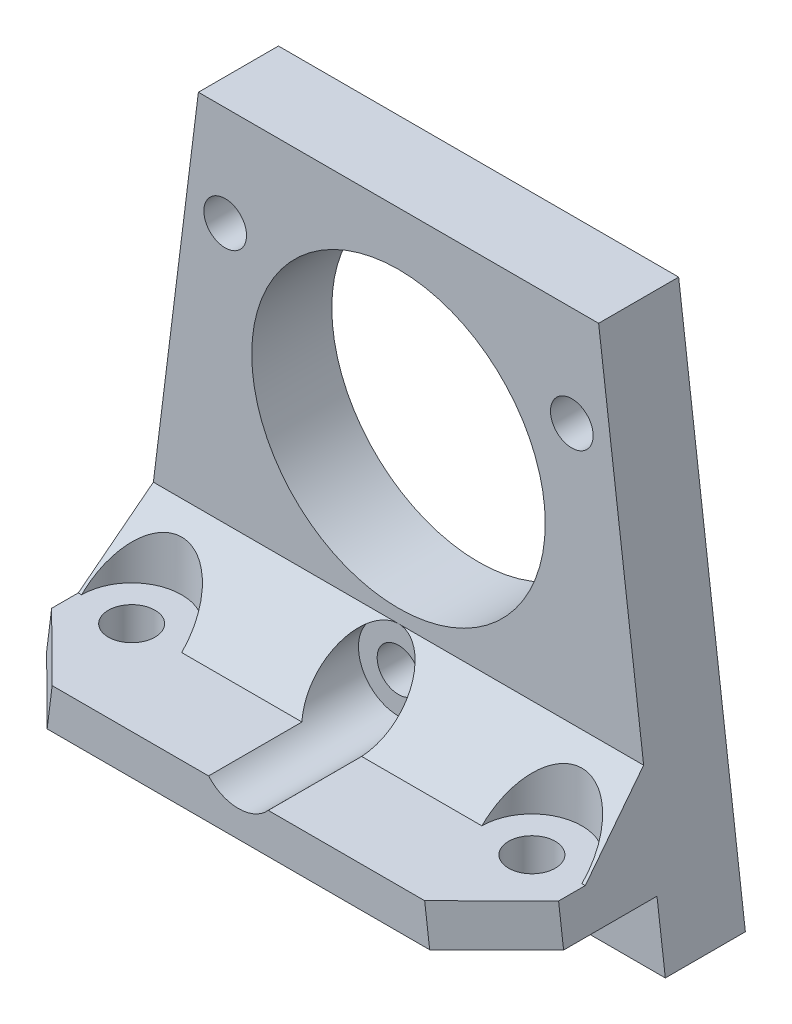
ISO-10303-21;
HEADER;
FILE_DESCRIPTION(('STEP AP214'),'2;1');
FILE_NAME('part.step','',(''),(''),'','','');
FILE_SCHEMA(('AUTOMOTIVE_DESIGN { 1 0 10303 214 1 1 1 1 }'));
ENDSEC;
DATA;
#1=APPLICATION_CONTEXT('core data for automotive mechanical design processes');
#2=APPLICATION_PROTOCOL_DEFINITION('international standard','automotive_design',2000,#1);
#3=PRODUCT_CONTEXT('',#1,'mechanical');
#4=PRODUCT('Part','Part','',(#3));
#5=PRODUCT_RELATED_PRODUCT_CATEGORY('part','',(#4));
#6=PRODUCT_DEFINITION_FORMATION('','',#4);
#7=PRODUCT_DEFINITION_CONTEXT('part definition',#1,'design');
#8=PRODUCT_DEFINITION('design','',#6,#7);
#9=PRODUCT_DEFINITION_SHAPE('','',#8);
#10=(LENGTH_UNIT() NAMED_UNIT(*) SI_UNIT(.MILLI.,.METRE.));
#11=(NAMED_UNIT(*) PLANE_ANGLE_UNIT() SI_UNIT($,.RADIAN.));
#12=(NAMED_UNIT(*) SI_UNIT($,.STERADIAN.) SOLID_ANGLE_UNIT());
#13=UNCERTAINTY_MEASURE_WITH_UNIT(LENGTH_MEASURE(1.E-05),#10,'distance_accuracy_value','');
#14=(GEOMETRIC_REPRESENTATION_CONTEXT(3) GLOBAL_UNCERTAINTY_ASSIGNED_CONTEXT((#13)) GLOBAL_UNIT_ASSIGNED_CONTEXT((#10,
#11,#12)) REPRESENTATION_CONTEXT('',''));
#15=CARTESIAN_POINT('',(0.,0.,0.));
#16=DIRECTION('',(0.,0.,1.));
#17=DIRECTION('',(1.,0.,0.));
#18=AXIS2_PLACEMENT_3D('',#15,#16,#17);
#19=CARTESIAN_POINT('',(-72.881062952465,-33.7647229682815,8.));
#20=DIRECTION('',(0.,1.,0.));
#21=DIRECTION('',(0.,0.,1.));
#22=AXIS2_PLACEMENT_3D('',#19,#20,#21);
#23=CYLINDRICAL_SURFACE('',#22,1.75);
#24=CARTESIAN_POINT('',(-72.881062952465,-28.8149754999757,8.));
#25=DIRECTION('',(0.,1.,0.));
#26=DIRECTION('',(0.,0.,1.));
#27=AXIS2_PLACEMENT_3D('',#24,#25,#26);
#28=CIRCLE('',#27,1.75);
#29=CARTESIAN_POINT('',(-72.881062952465,-28.8149754999757,9.75));
#30=VERTEX_POINT('',#29);
#31=EDGE_CURVE('E313',#30,#30,#28,.F.);
#32=ORIENTED_EDGE('',*,*,#31,.T.);
#33=EDGE_LOOP('',(#32));
#34=FACE_BOUND('',#33,.T.);
#35=CARTESIAN_POINT('',(-72.881062952465,-25.8149754999757,8.));
#36=DIRECTION('',(0.,1.,0.));
#37=DIRECTION('',(0.,0.,1.));
#38=AXIS2_PLACEMENT_3D('',#35,#36,#37);
#39=CIRCLE('',#38,1.75);
#40=CARTESIAN_POINT('',(-72.881062952465,-25.8149754999757,9.75));
#41=VERTEX_POINT('',#40);
#42=EDGE_CURVE('E310',#41,#41,#39,.T.);
#43=ORIENTED_EDGE('',*,*,#42,.T.);
#44=EDGE_LOOP('',(#43));
#45=FACE_BOUND('',#44,.T.);
#46=ADVANCED_FACE('F135',(#34,#45),#23,.F.);
#47=CARTESIAN_POINT('',(0.,-25.8149754999757,8.00000000000003));
#48=DIRECTION('',(0.,0.707106781186551,0.707106781186544));
#49=DIRECTION('',(1.,0.,0.));
#50=AXIS2_PLACEMENT_3D('',#47,#48,#49);
#51=PLANE('',#50);
#52=CARTESIAN_POINT('',(-72.881062952465,-25.8149755000545,8.));
#53=DIRECTION('',(0.,0.707106781186551,0.707106781186544));
#54=DIRECTION('',(0.,-0.707106781186544,0.707106781186551));
#55=AXIS2_PLACEMENT_3D('',#52,#53,#54);
#56=ELLIPSE('',#55,5.30330085889909,3.75000000000001);
#57=CARTESIAN_POINT('',(-76.631062952465,-25.8149754999757,8.00000000000003));
#58=VERTEX_POINT('',#57);
#59=CARTESIAN_POINT('',(-69.131062952465,-25.8149754999757,8.00000000000003));
#60=VERTEX_POINT('',#59);
#61=EDGE_CURVE('E283',#58,#60,#56,.F.);
#62=ORIENTED_EDGE('',*,*,#61,.T.);
#63=DIRECTION('',(-1.,0.,0.));
#64=VECTOR('',#63,1.);
#65=CARTESIAN_POINT('',(-76.881062952465,-25.8149754999757,8.00000000000003));
#66=LINE('',#65,#64);
#67=CARTESIAN_POINT('',(-60.1171309299648,-25.8149754999757,8.00000000000003));
#68=VERTEX_POINT('',#67);
#69=EDGE_CURVE('E367',#68,#60,#66,.T.);
#70=ORIENTED_EDGE('',*,*,#69,.F.);
#71=CARTESIAN_POINT('',(-57.881062952465,-23.8149754999757,6.00000000000001));
#72=DIRECTION('',(0.,0.707106781186551,0.707106781186544));
#73=DIRECTION('',(0.,0.707106781186544,-0.707106781186551));
#74=AXIS2_PLACEMENT_3D('',#71,#72,#73);
#75=ELLIPSE('',#74,4.24264068711931,3.);
#76=CARTESIAN_POINT('',(-57.881062952465,-20.8149754999757,3.));
#77=VERTEX_POINT('',#76);
#78=EDGE_CURVE('E12',#77,#68,#75,.T.);
#79=ORIENTED_EDGE('',*,*,#78,.F.);
#80=DIRECTION('',(1.,0.,0.));
#81=VECTOR('',#80,1.);
#82=CARTESIAN_POINT('',(-60.1171309299648,-20.8149754999757,3.));
#83=LINE('',#82,#81);
#84=CARTESIAN_POINT('',(-76.256062952465,-20.8149754999757,3.));
#85=VERTEX_POINT('',#84);
#86=EDGE_CURVE('E390',#85,#77,#83,.T.);
#87=ORIENTED_EDGE('',*,*,#86,.F.);
#88=DIRECTION('',(-0.0880450906325621,-0.704360725060496,0.704360725060502));
#89=VECTOR('',#88,1.);
#90=CARTESIAN_POINT('',(-76.2850857202754,-21.0471576424585,3.23218214248282));
#91=LINE('',#90,#89);
#92=CARTESIAN_POINT('',(-76.881062952465,-25.8149754999757,8.00000000000003));
#93=VERTEX_POINT('',#92);
#94=EDGE_CURVE('E143',#93,#85,#91,.F.);
#95=ORIENTED_EDGE('',*,*,#94,.F.);
#96=DIRECTION('',(-1.,0.,0.));
#97=VECTOR('',#96,1.);
#98=CARTESIAN_POINT('',(-76.881062952465,-25.8149754999757,8.00000000000003));
#99=LINE('',#98,#97);
#100=EDGE_CURVE('E365',#58,#93,#99,.T.);
#101=ORIENTED_EDGE('',*,*,#100,.F.);
#102=EDGE_LOOP('',(#62,#70,#79,#87,#95,#101));
#103=FACE_BOUND('',#102,.T.);
#104=ADVANCED_FACE('F137',(#103),#51,.T.);
#105=CARTESIAN_POINT('',(-42.881062952465,-33.7647229682815,8.));
#106=DIRECTION('',(0.,1.,0.));
#107=DIRECTION('',(0.,0.,1.));
#108=AXIS2_PLACEMENT_3D('',#105,#106,#107);
#109=CYLINDRICAL_SURFACE('',#108,1.75);
#110=CARTESIAN_POINT('',(-42.881062952465,-28.8149754999757,8.));
#111=DIRECTION('',(0.,1.,0.));
#112=DIRECTION('',(0.,0.,1.));
#113=AXIS2_PLACEMENT_3D('',#110,#111,#112);
#114=CIRCLE('',#113,1.75);
#115=CARTESIAN_POINT('',(-42.881062952465,-28.8149754999757,9.75));
#116=VERTEX_POINT('',#115);
#117=EDGE_CURVE('E307',#116,#116,#114,.F.);
#118=ORIENTED_EDGE('',*,*,#117,.T.);
#119=EDGE_LOOP('',(#118));
#120=FACE_BOUND('',#119,.T.);
#121=CARTESIAN_POINT('',(-42.881062952465,-25.8149754999757,8.));
#122=DIRECTION('',(0.,1.,0.));
#123=DIRECTION('',(0.,0.,1.));
#124=AXIS2_PLACEMENT_3D('',#121,#122,#123);
#125=CIRCLE('',#124,1.75);
#126=CARTESIAN_POINT('',(-42.881062952465,-25.8149754999757,9.75));
#127=VERTEX_POINT('',#126);
#128=EDGE_CURVE('E304',#127,#127,#125,.T.);
#129=ORIENTED_EDGE('',*,*,#128,.T.);
#130=EDGE_LOOP('',(#129));
#131=FACE_BOUND('',#130,.T.);
#132=ADVANCED_FACE('F470',(#120,#131),#109,.F.);
#133=CARTESIAN_POINT('',(0.,-25.8149754999757,7.99999999999998));
#134=DIRECTION('',(0.,0.707106781186544,0.707106781186551));
#135=DIRECTION('',(1.,0.,0.));
#136=AXIS2_PLACEMENT_3D('',#133,#134,#135);
#137=PLANE('',#136);
#138=CARTESIAN_POINT('',(-42.881062952465,-25.8149754999977,8.));
#139=DIRECTION('',(0.,0.707106781186544,0.707106781186551));
#140=DIRECTION('',(0.,-0.707106781186551,0.707106781186544));
#141=AXIS2_PLACEMENT_3D('',#138,#139,#140);
#142=ELLIPSE('',#141,5.30330085889914,3.75000000000001);
#143=CARTESIAN_POINT('',(-46.631062952465,-25.8149754999757,7.99999999999998));
#144=VERTEX_POINT('',#143);
#145=CARTESIAN_POINT('',(-39.131062952465,-25.8149754999757,7.99999999999998));
#146=VERTEX_POINT('',#145);
#147=EDGE_CURVE('E289',#144,#146,#142,.F.);
#148=ORIENTED_EDGE('',*,*,#147,.T.);
#149=DIRECTION('',(-1.,0.,0.));
#150=VECTOR('',#149,1.);
#151=CARTESIAN_POINT('',(-55.6449949749652,-25.8149754999757,7.99999999999998));
#152=LINE('',#151,#150);
#153=CARTESIAN_POINT('',(-38.881062952465,-25.8149754999757,7.99999999999998));
#154=VERTEX_POINT('',#153);
#155=EDGE_CURVE('E383',#154,#146,#152,.T.);
#156=ORIENTED_EDGE('',*,*,#155,.F.);
#157=DIRECTION('',(-0.0880450906325629,0.704360725060503,-0.704360725060496));
#158=VECTOR('',#157,1.);
#159=CARTESIAN_POINT('',(-40.4906655962428,-12.9381543497529,-4.87682115022266));
#160=LINE('',#159,#158);
#161=CARTESIAN_POINT('',(-39.506062952465,-20.8149754999757,3.));
#162=VERTEX_POINT('',#161);
#163=EDGE_CURVE('E395',#162,#154,#160,.F.);
#164=ORIENTED_EDGE('',*,*,#163,.F.);
#165=DIRECTION('',(1.,0.,0.));
#166=VECTOR('',#165,1.);
#167=CARTESIAN_POINT('',(-38.881062952465,-20.8149754999757,3.));
#168=LINE('',#167,#166);
#169=EDGE_CURVE('E156',#77,#162,#168,.T.);
#170=ORIENTED_EDGE('',*,*,#169,.F.);
#171=CARTESIAN_POINT('',(-57.881062952465,-23.8149754999757,6.));
#172=DIRECTION('',(0.,0.707106781186544,0.707106781186551));
#173=DIRECTION('',(0.,0.707106781186551,-0.707106781186544));
#174=AXIS2_PLACEMENT_3D('',#171,#172,#173);
#175=ELLIPSE('',#174,4.24264068711927,3.);
#176=CARTESIAN_POINT('',(-55.6449949749652,-25.8149754999757,7.99999999999998));
#177=VERTEX_POINT('',#176);
#178=EDGE_CURVE('E393',#177,#77,#175,.T.);
#179=ORIENTED_EDGE('',*,*,#178,.F.);
#180=DIRECTION('',(-1.,0.,0.));
#181=VECTOR('',#180,1.);
#182=CARTESIAN_POINT('',(-55.6449949749652,-25.8149754999757,7.99999999999998));
#183=LINE('',#182,#181);
#184=EDGE_CURVE('E381',#144,#177,#183,.T.);
#185=ORIENTED_EDGE('',*,*,#184,.F.);
#186=EDGE_LOOP('',(#148,#156,#164,#170,#179,#185));
#187=FACE_BOUND('',#186,.T.);
#188=ADVANCED_FACE('F448',(#187),#137,.T.);
#189=CARTESIAN_POINT('',(0.,0.,3.));
#190=DIRECTION('',(0.,0.,1.));
#191=DIRECTION('',(1.,0.,0.));
#192=AXIS2_PLACEMENT_3D('',#189,#190,#191);
#193=PLANE('',#192);
#194=CARTESIAN_POINT('',(-57.881062952465,-23.8149754999757,3.));
#195=DIRECTION('',(0.,0.,1.));
#196=DIRECTION('',(1.,0.,0.));
#197=AXIS2_PLACEMENT_3D('',#194,#195,#196);
#198=CIRCLE('',#197,1.6);
#199=CARTESIAN_POINT('',(-56.281062952465,-23.8149754999757,3.));
#200=VERTEX_POINT('',#199);
#201=EDGE_CURVE('E344',#200,#200,#198,.T.);
#202=ORIENTED_EDGE('',*,*,#201,.F.);
#203=EDGE_LOOP('',(#202));
#204=FACE_BOUND('',#203,.T.);
#205=CARTESIAN_POINT('',(-57.881062952465,-23.8149754999757,3.));
#206=DIRECTION('',(0.,0.,1.));
#207=DIRECTION('',(1.,0.,0.));
#208=AXIS2_PLACEMENT_3D('',#205,#206,#207);
#209=CIRCLE('',#208,3.);
#210=EDGE_CURVE('E149',#77,#77,#209,.T.);
#211=ORIENTED_EDGE('',*,*,#210,.T.);
#212=EDGE_LOOP('',(#211));
#213=FACE_BOUND('',#212,.T.);
#214=ADVANCED_FACE('F482',(#204,#213),#193,.T.);
#215=CARTESIAN_POINT('',(0.,-25.8149754999757,15.));
#216=DIRECTION('',(0.,1.,0.));
#217=DIRECTION('',(0.,0.,1.));
#218=AXIS2_PLACEMENT_3D('',#215,#216,#217);
#219=PLANE('',#218);
#220=CARTESIAN_POINT('',(-42.881062952465,-25.8149754999757,8.));
#221=DIRECTION('',(0.,1.,0.));
#222=DIRECTION('',(0.,0.,1.));
#223=AXIS2_PLACEMENT_3D('',#220,#221,#222);
#224=CIRCLE('',#223,3.75000000000001);
#225=EDGE_CURVE('E292',#146,#144,#224,.T.);
#226=ORIENTED_EDGE('',*,*,#225,.T.);
#227=ORIENTED_EDGE('',*,*,#184,.T.);
#228=DIRECTION('',(0.,0.,-1.));
#229=VECTOR('',#228,1.);
#230=CARTESIAN_POINT('',(-55.6449949749652,-25.8149754999757,23.4852813742386));
#231=LINE('',#230,#229);
#232=CARTESIAN_POINT('',(-55.6449949749652,-25.8149754999757,15.));
#233=VERTEX_POINT('',#232);
#234=EDGE_CURVE('E302',#177,#233,#231,.F.);
#235=ORIENTED_EDGE('',*,*,#234,.T.);
#236=DIRECTION('',(1.,0.,0.));
#237=VECTOR('',#236,1.);
#238=CARTESIAN_POINT('',(0.,-25.8149754999757,15.));
#239=LINE('',#238,#237);
#240=CARTESIAN_POINT('',(-43.9199740451516,-25.8149754999757,15.));
#241=VERTEX_POINT('',#240);
#242=EDGE_CURVE('E316',#233,#241,#239,.T.);
#243=ORIENTED_EDGE('',*,*,#242,.T.);
#244=DIRECTION('',(0.709842214152023,0.,-0.7043607250605));
#245=VECTOR('',#244,1.);
#246=CARTESIAN_POINT('',(-21.7897545650365,-25.8149754999757,-6.95932719693609));
#247=LINE('',#246,#245);
#248=CARTESIAN_POINT('',(-38.881062952465,-25.8149754999757,9.99999999999999));
#249=VERTEX_POINT('',#248);
#250=EDGE_CURVE('E386',#241,#249,#247,.T.);
#251=ORIENTED_EDGE('',*,*,#250,.T.);
#252=DIRECTION('',(0.,0.,-1.));
#253=VECTOR('',#252,1.);
#254=CARTESIAN_POINT('',(-38.881062952465,-25.8149754999757,15.));
#255=LINE('',#254,#253);
#256=EDGE_CURVE('E322',#249,#154,#255,.T.);
#257=ORIENTED_EDGE('',*,*,#256,.T.);
#258=ORIENTED_EDGE('',*,*,#155,.T.);
#259=EDGE_LOOP('',(#226,#227,#235,#243,#251,#257,#258));
#260=FACE_BOUND('',#259,.T.);
#261=ORIENTED_EDGE('',*,*,#128,.F.);
#262=EDGE_LOOP('',(#261));
#263=FACE_BOUND('',#262,.T.);
#264=ADVANCED_FACE('F442',(#260,#263),#219,.T.);
#265=CARTESIAN_POINT('',(-72.881062952465,-25.8149754999757,8.));
#266=DIRECTION('',(0.,1.,0.));
#267=DIRECTION('',(0.,0.,1.));
#268=AXIS2_PLACEMENT_3D('',#265,#266,#267);
#269=CIRCLE('',#268,3.75000000000001);
#270=EDGE_CURVE('E286',#60,#58,#269,.T.);
#271=ORIENTED_EDGE('',*,*,#270,.T.);
#272=ORIENTED_EDGE('',*,*,#100,.T.);
#273=DIRECTION('',(0.,0.,-1.));
#274=VECTOR('',#273,1.);
#275=CARTESIAN_POINT('',(-76.881062952465,-25.8149754999757,15.));
#276=LINE('',#275,#274);
#277=CARTESIAN_POINT('',(-76.881062952465,-25.8149754999757,10.));
#278=VERTEX_POINT('',#277);
#279=EDGE_CURVE('E329',#278,#93,#276,.T.);
#280=ORIENTED_EDGE('',*,*,#279,.F.);
#281=DIRECTION('',(-0.709842214152025,0.,-0.704360725060498));
#282=VECTOR('',#281,1.);
#283=CARTESIAN_POINT('',(-35.6426179769443,-25.8149754999757,50.9199966192831));
#284=LINE('',#283,#282);
#285=CARTESIAN_POINT('',(-71.8421518597784,-25.8149754999757,15.));
#286=VERTEX_POINT('',#285);
#287=EDGE_CURVE('E370',#278,#286,#284,.F.);
#288=ORIENTED_EDGE('',*,*,#287,.T.);
#289=CARTESIAN_POINT('',(-60.1171309299648,-25.8149754999757,15.));
#290=VERTEX_POINT('',#289);
#291=EDGE_CURVE('E317',#286,#290,#239,.T.);
#292=ORIENTED_EDGE('',*,*,#291,.T.);
#293=DIRECTION('',(0.,0.,-1.));
#294=VECTOR('',#293,1.);
#295=CARTESIAN_POINT('',(-60.1171309299648,-25.8149754999757,23.4852813742386));
#296=LINE('',#295,#294);
#297=EDGE_CURVE('E299',#290,#68,#296,.T.);
#298=ORIENTED_EDGE('',*,*,#297,.T.);
#299=ORIENTED_EDGE('',*,*,#69,.T.);
#300=EDGE_LOOP('',(#271,#272,#280,#288,#292,#298,#299));
#301=FACE_BOUND('',#300,.T.);
#302=ORIENTED_EDGE('',*,*,#42,.F.);
#303=EDGE_LOOP('',(#302));
#304=FACE_BOUND('',#303,.T.);
#305=ADVANCED_FACE('F409',(#301,#304),#219,.T.);
#306=DIRECTION('',(-0.124034734589209,0.992277876713668,0.));
#307=VECTOR('',#306,1.);
#308=CARTESIAN_POINT('',(-41.4601205070395,-5.18251506337994,3.));
#309=LINE('',#308,#307);
#310=CARTESIAN_POINT('',(-37.881062952465,-33.8149754999757,3.));
#311=VERTEX_POINT('',#310);
#312=CARTESIAN_POINT('',(-38.506062952465,-28.8149754999757,3.));
#313=VERTEX_POINT('',#312);
#314=EDGE_CURVE('E355',#311,#313,#309,.T.);
#315=ORIENTED_EDGE('',*,*,#314,.T.);
#316=DIRECTION('',(-1.,0.,0.));
#317=VECTOR('',#316,1.);
#318=CARTESIAN_POINT('',(0.,-28.8149754999757,3.));
#319=LINE('',#318,#317);
#320=CARTESIAN_POINT('',(-77.256062952465,-28.8149754999757,3.));
#321=VERTEX_POINT('',#320);
#322=EDGE_CURVE('E332',#313,#321,#319,.T.);
#323=ORIENTED_EDGE('',*,*,#322,.T.);
#324=DIRECTION('',(0.124034734589209,0.992277876713668,0.));
#325=VECTOR('',#324,1.);
#326=CARTESIAN_POINT('',(-72.5210496147377,9.06513120184222,3.));
#327=LINE('',#326,#325);
#328=CARTESIAN_POINT('',(-77.881062952465,-33.8149754999757,3.));
#329=VERTEX_POINT('',#328);
#330=EDGE_CURVE('E348',#329,#321,#327,.T.);
#331=ORIENTED_EDGE('',*,*,#330,.F.);
#332=DIRECTION('',(-1.,0.,0.));
#333=VECTOR('',#332,1.);
#334=CARTESIAN_POINT('',(0.,-33.8149754999757,3.));
#335=LINE('',#334,#333);
#336=EDGE_CURVE('E257',#311,#329,#335,.T.);
#337=ORIENTED_EDGE('',*,*,#336,.F.);
#338=EDGE_LOOP('',(#315,#323,#331,#337));
#339=FACE_BOUND('',#338,.T.);
#340=ADVANCED_FACE('F426',(#339),#193,.T.);
#341=CARTESIAN_POINT('',(0.,-33.8149754999757,3.));
#342=DIRECTION('',(0.,-1.,0.));
#343=DIRECTION('',(0.,0.,-1.));
#344=AXIS2_PLACEMENT_3D('',#341,#342,#343);
#345=PLANE('',#344);
#346=DIRECTION('',(0.,0.,-1.));
#347=VECTOR('',#346,1.);
#348=CARTESIAN_POINT('',(-77.881062952465,-33.8149754999757,3.));
#349=LINE('',#348,#347);
#350=CARTESIAN_POINT('',(-77.881062952465,-33.8149754999757,-3.));
#351=VERTEX_POINT('',#350);
#352=EDGE_CURVE('E256',#329,#351,#349,.T.);
#353=ORIENTED_EDGE('',*,*,#352,.T.);
#354=DIRECTION('',(-1.,0.,0.));
#355=VECTOR('',#354,1.);
#356=CARTESIAN_POINT('',(-37.881062952465,-33.8149754999757,-3.));
#357=LINE('',#356,#355);
#358=CARTESIAN_POINT('',(-37.881062952465,-33.8149754999757,-3.));
#359=VERTEX_POINT('',#358);
#360=EDGE_CURVE('E273',#359,#351,#357,.T.);
#361=ORIENTED_EDGE('',*,*,#360,.F.);
#362=DIRECTION('',(0.,0.,-1.));
#363=VECTOR('',#362,1.);
#364=CARTESIAN_POINT('',(-37.881062952465,-33.8149754999757,3.));
#365=LINE('',#364,#363);
#366=EDGE_CURVE('E361',#311,#359,#365,.T.);
#367=ORIENTED_EDGE('',*,*,#366,.F.);
#368=ORIENTED_EDGE('',*,*,#336,.T.);
#369=EDGE_LOOP('',(#353,#361,#367,#368));
#370=FACE_BOUND('',#369,.T.);
#371=ADVANCED_FACE('F430',(#370),#345,.T.);
#372=CARTESIAN_POINT('',(-72.5210496147377,9.06513120184222,3.));
#373=DIRECTION('',(-0.992277876713668,0.124034734589209,0.));
#374=DIRECTION('',(-0.124034734589209,-0.992277876713668,0.));
#375=AXIS2_PLACEMENT_3D('',#372,#373,#374);
#376=PLANE('',#375);
#377=DIRECTION('',(0.,0.,-1.));
#378=VECTOR('',#377,1.);
#379=CARTESIAN_POINT('',(-77.256062952465,-28.8149754999757,15.));
#380=LINE('',#379,#378);
#381=CARTESIAN_POINT('',(-77.256062952465,-28.8149754999757,10.));
#382=VERTEX_POINT('',#381);
#383=EDGE_CURVE('E327',#382,#321,#380,.T.);
#384=ORIENTED_EDGE('',*,*,#383,.F.);
#385=DIRECTION('',(0.124034734589209,0.992277876713668,0.));
#386=VECTOR('',#385,1.);
#387=CARTESIAN_POINT('',(-72.5210496147377,9.06513120184222,10.));
#388=LINE('',#387,#386);
#389=EDGE_CURVE('E354',#382,#278,#388,.T.);
#390=ORIENTED_EDGE('',*,*,#389,.T.);
#391=ORIENTED_EDGE('',*,*,#279,.T.);
#392=ORIENTED_EDGE('',*,*,#94,.T.);
#393=CARTESIAN_POINT('',(-72.881062952465,6.18502450002429,3.));
#394=VERTEX_POINT('',#393);
#395=EDGE_CURVE('E252',#85,#394,#327,.T.);
#396=ORIENTED_EDGE('',*,*,#395,.T.);
#397=DIRECTION('',(0.,0.,-1.));
#398=VECTOR('',#397,1.);
#399=CARTESIAN_POINT('',(-72.881062952465,6.18502450002429,3.));
#400=LINE('',#399,#398);
#401=CARTESIAN_POINT('',(-72.881062952465,6.18502450002429,-3.));
#402=VERTEX_POINT('',#401);
#403=EDGE_CURVE('E245',#394,#402,#400,.T.);
#404=ORIENTED_EDGE('',*,*,#403,.T.);
#405=DIRECTION('',(0.124034734589209,0.992277876713668,0.));
#406=VECTOR('',#405,1.);
#407=CARTESIAN_POINT('',(-77.881062952465,-33.8149754999757,-3.));
#408=LINE('',#407,#406);
#409=EDGE_CURVE('E250',#351,#402,#408,.T.);
#410=ORIENTED_EDGE('',*,*,#409,.F.);
#411=ORIENTED_EDGE('',*,*,#352,.F.);
#412=ORIENTED_EDGE('',*,*,#330,.T.);
#413=EDGE_LOOP('',(#384,#390,#391,#392,#396,#404,#410,#411,#412));
#414=FACE_BOUND('',#413,.T.);
#415=ADVANCED_FACE('F248',(#414),#376,.T.);
#416=ORIENTED_EDGE('',*,*,#86,.T.);
#417=ORIENTED_EDGE('',*,*,#169,.T.);
#418=CARTESIAN_POINT('',(-42.881062952465,6.18502450002429,3.));
#419=VERTEX_POINT('',#418);
#420=EDGE_CURVE('E347',#162,#419,#309,.T.);
#421=ORIENTED_EDGE('',*,*,#420,.T.);
#422=DIRECTION('',(1.,0.,0.));
#423=VECTOR('',#422,1.);
#424=CARTESIAN_POINT('',(0.,6.18502450002429,3.));
#425=LINE('',#424,#423);
#426=EDGE_CURVE('E358',#394,#419,#425,.T.);
#427=ORIENTED_EDGE('',*,*,#426,.F.);
#428=ORIENTED_EDGE('',*,*,#395,.F.);
#429=EDGE_LOOP('',(#416,#417,#421,#427,#428));
#430=FACE_BOUND('',#429,.T.);
#431=CARTESIAN_POINT('',(-44.8906818956985,-1.31497549997563,3.));
#432=DIRECTION('',(0.,0.,1.));
#433=DIRECTION('',(1.,0.,0.));
#434=AXIS2_PLACEMENT_3D('',#431,#432,#433);
#435=CIRCLE('',#434,1.6);
#436=CARTESIAN_POINT('',(-43.2906818956985,-1.31497549997563,3.));
#437=VERTEX_POINT('',#436);
#438=EDGE_CURVE('E335',#437,#437,#435,.T.);
#439=ORIENTED_EDGE('',*,*,#438,.F.);
#440=EDGE_LOOP('',(#439));
#441=FACE_BOUND('',#440,.T.);
#442=CARTESIAN_POINT('',(-70.8714440092316,-1.31497549997575,3.));
#443=DIRECTION('',(0.,0.,1.));
#444=DIRECTION('',(1.,0.,0.));
#445=AXIS2_PLACEMENT_3D('',#442,#443,#444);
#446=CIRCLE('',#445,1.59999999999999);
#447=CARTESIAN_POINT('',(-69.2714440092316,-1.31497549997575,3.));
#448=VERTEX_POINT('',#447);
#449=EDGE_CURVE('E336',#448,#448,#446,.T.);
#450=ORIENTED_EDGE('',*,*,#449,.F.);
#451=EDGE_LOOP('',(#450));
#452=FACE_BOUND('',#451,.T.);
#453=CARTESIAN_POINT('',(-57.881062952465,-8.81497549997571,3.));
#454=DIRECTION('',(0.,0.,1.));
#455=DIRECTION('',(1.,0.,0.));
#456=AXIS2_PLACEMENT_3D('',#453,#454,#455);
#457=CIRCLE('',#456,11.);
#458=CARTESIAN_POINT('',(-46.881062952465,-8.81497549997571,3.));
#459=VERTEX_POINT('',#458);
#460=EDGE_CURVE('E339',#459,#459,#457,.T.);
#461=ORIENTED_EDGE('',*,*,#460,.F.);
#462=EDGE_LOOP('',(#461));
#463=FACE_BOUND('',#462,.T.);
#464=ADVANCED_FACE('F401',(#430,#441,#452,#463),#193,.T.);
#465=CARTESIAN_POINT('',(-41.4601205070395,-5.18251506337994,3.));
#466=DIRECTION('',(-0.992277876713668,-0.124034734589209,0.));
#467=DIRECTION('',(0.124034734589209,-0.992277876713668,0.));
#468=AXIS2_PLACEMENT_3D('',#465,#466,#467);
#469=PLANE('',#468);
#470=ORIENTED_EDGE('',*,*,#256,.F.);
#471=DIRECTION('',(0.124034734589209,-0.992277876713668,0.));
#472=VECTOR('',#471,1.);
#473=CARTESIAN_POINT('',(-38.506062952465,-28.8149754999757,9.99999999999999));
#474=LINE('',#473,#472);
#475=CARTESIAN_POINT('',(-38.506062952465,-28.8149754999757,9.99999999999999));
#476=VERTEX_POINT('',#475);
#477=EDGE_CURVE('E388',#249,#476,#474,.T.);
#478=ORIENTED_EDGE('',*,*,#477,.T.);
#479=DIRECTION('',(0.,0.,-1.));
#480=VECTOR('',#479,1.);
#481=CARTESIAN_POINT('',(-38.506062952465,-28.8149754999757,15.));
#482=LINE('',#481,#480);
#483=EDGE_CURVE('E325',#476,#313,#482,.T.);
#484=ORIENTED_EDGE('',*,*,#483,.T.);
#485=ORIENTED_EDGE('',*,*,#314,.F.);
#486=ORIENTED_EDGE('',*,*,#366,.T.);
#487=DIRECTION('',(0.124034734589209,-0.992277876713668,0.));
#488=VECTOR('',#487,1.);
#489=CARTESIAN_POINT('',(-42.881062952465,6.18502450002429,-3.));
#490=LINE('',#489,#488);
#491=CARTESIAN_POINT('',(-42.881062952465,6.18502450002429,-3.));
#492=VERTEX_POINT('',#491);
#493=EDGE_CURVE('E267',#492,#359,#490,.T.);
#494=ORIENTED_EDGE('',*,*,#493,.F.);
#495=DIRECTION('',(0.,0.,-1.));
#496=VECTOR('',#495,1.);
#497=CARTESIAN_POINT('',(-42.881062952465,6.18502450002429,3.));
#498=LINE('',#497,#496);
#499=EDGE_CURVE('E263',#419,#492,#498,.T.);
#500=ORIENTED_EDGE('',*,*,#499,.F.);
#501=ORIENTED_EDGE('',*,*,#420,.F.);
#502=ORIENTED_EDGE('',*,*,#163,.T.);
#503=EDGE_LOOP('',(#470,#478,#484,#485,#486,#494,#500,#501,#502));
#504=FACE_BOUND('',#503,.T.);
#505=ADVANCED_FACE('F433',(#504),#469,.F.);
#506=CARTESIAN_POINT('',(0.,6.18502450002429,3.));
#507=DIRECTION('',(0.,1.,0.));
#508=DIRECTION('',(0.,0.,1.));
#509=AXIS2_PLACEMENT_3D('',#506,#507,#508);
#510=PLANE('',#509);
#511=ORIENTED_EDGE('',*,*,#499,.T.);
#512=DIRECTION('',(1.,0.,0.));
#513=VECTOR('',#512,1.);
#514=CARTESIAN_POINT('',(-72.881062952465,6.18502450002429,-3.));
#515=LINE('',#514,#513);
#516=EDGE_CURVE('E260',#402,#492,#515,.T.);
#517=ORIENTED_EDGE('',*,*,#516,.F.);
#518=ORIENTED_EDGE('',*,*,#403,.F.);
#519=ORIENTED_EDGE('',*,*,#426,.T.);
#520=EDGE_LOOP('',(#511,#517,#518,#519));
#521=FACE_BOUND('',#520,.T.);
#522=ADVANCED_FACE('F261',(#521),#510,.T.);
#523=CARTESIAN_POINT('',(-57.881062952465,-23.8149754999757,34.1126983722081));
#524=DIRECTION('',(0.,0.,-1.));
#525=DIRECTION('',(-1.,0.,0.));
#526=AXIS2_PLACEMENT_3D('',#523,#524,#525);
#527=CYLINDRICAL_SURFACE('',#526,1.6);
#528=ORIENTED_EDGE('',*,*,#201,.T.);
#529=EDGE_LOOP('',(#528));
#530=FACE_BOUND('',#529,.T.);
#531=CARTESIAN_POINT('',(-57.881062952465,-23.8149754999757,-3.));
#532=DIRECTION('',(0.,0.,-1.));
#533=DIRECTION('',(-1.,0.,0.));
#534=AXIS2_PLACEMENT_3D('',#531,#532,#533);
#535=CIRCLE('',#534,1.6);
#536=CARTESIAN_POINT('',(-59.481062952465,-23.8149754999757,-3.));
#537=VERTEX_POINT('',#536);
#538=EDGE_CURVE('E801',#537,#537,#535,.T.);
#539=ORIENTED_EDGE('',*,*,#538,.T.);
#540=EDGE_LOOP('',(#539));
#541=FACE_BOUND('',#540,.T.);
#542=ADVANCED_FACE('F493',(#530,#541),#527,.F.);
#543=CARTESIAN_POINT('',(-57.881062952465,-8.81497549997571,34.1126983722081));
#544=DIRECTION('',(0.,0.,-1.));
#545=DIRECTION('',(-1.,0.,0.));
#546=AXIS2_PLACEMENT_3D('',#543,#544,#545);
#547=CYLINDRICAL_SURFACE('',#546,11.);
#548=ORIENTED_EDGE('',*,*,#460,.T.);
#549=EDGE_LOOP('',(#548));
#550=FACE_BOUND('',#549,.T.);
#551=CARTESIAN_POINT('',(-57.881062952465,-8.81497549997571,-3.));
#552=DIRECTION('',(0.,0.,-1.));
#553=DIRECTION('',(-1.,0.,0.));
#554=AXIS2_PLACEMENT_3D('',#551,#552,#553);
#555=CIRCLE('',#554,11.);
#556=CARTESIAN_POINT('',(-68.881062952465,-8.81497549997571,-3.));
#557=VERTEX_POINT('',#556);
#558=EDGE_CURVE('E274',#557,#557,#555,.T.);
#559=ORIENTED_EDGE('',*,*,#558,.T.);
#560=EDGE_LOOP('',(#559));
#561=FACE_BOUND('',#560,.T.);
#562=ADVANCED_FACE('F486',(#550,#561),#547,.F.);
#563=CARTESIAN_POINT('',(-70.8714440092316,-1.31497549997575,34.1126983722081));
#564=DIRECTION('',(0.,0.,-1.));
#565=DIRECTION('',(-1.,0.,0.));
#566=AXIS2_PLACEMENT_3D('',#563,#564,#565);
#567=CYLINDRICAL_SURFACE('',#566,1.59999999999999);
#568=ORIENTED_EDGE('',*,*,#449,.T.);
#569=EDGE_LOOP('',(#568));
#570=FACE_BOUND('',#569,.T.);
#571=CARTESIAN_POINT('',(-70.8714440092316,-1.31497549997575,-3.));
#572=DIRECTION('',(0.,0.,-1.));
#573=DIRECTION('',(-1.,0.,0.));
#574=AXIS2_PLACEMENT_3D('',#571,#572,#573);
#575=CIRCLE('',#574,1.59999999999999);
#576=CARTESIAN_POINT('',(-72.4714440092316,-1.31497549997575,-3.));
#577=VERTEX_POINT('',#576);
#578=EDGE_CURVE('E797',#577,#577,#575,.T.);
#579=ORIENTED_EDGE('',*,*,#578,.T.);
#580=EDGE_LOOP('',(#579));
#581=FACE_BOUND('',#580,.T.);
#582=ADVANCED_FACE('F483',(#570,#581),#567,.F.);
#583=CARTESIAN_POINT('',(-44.8906818956985,-1.31497549997563,34.1126983722081));
#584=DIRECTION('',(0.,0.,-1.));
#585=DIRECTION('',(-1.,0.,0.));
#586=AXIS2_PLACEMENT_3D('',#583,#584,#585);
#587=CYLINDRICAL_SURFACE('',#586,1.6);
#588=ORIENTED_EDGE('',*,*,#438,.T.);
#589=EDGE_LOOP('',(#588));
#590=FACE_BOUND('',#589,.T.);
#591=CARTESIAN_POINT('',(-44.8906818956985,-1.31497549997563,-3.));
#592=DIRECTION('',(0.,0.,-1.));
#593=DIRECTION('',(-1.,0.,0.));
#594=AXIS2_PLACEMENT_3D('',#591,#592,#593);
#595=CIRCLE('',#594,1.6);
#596=CARTESIAN_POINT('',(-46.4906818956985,-1.31497549997563,-3.));
#597=VERTEX_POINT('',#596);
#598=EDGE_CURVE('E277',#597,#597,#595,.T.);
#599=ORIENTED_EDGE('',*,*,#598,.T.);
#600=EDGE_LOOP('',(#599));
#601=FACE_BOUND('',#600,.T.);
#602=ADVANCED_FACE('F478',(#590,#601),#587,.F.);
#603=CARTESIAN_POINT('',(0.,-28.8149754999757,15.));
#604=DIRECTION('',(0.,1.,0.));
#605=DIRECTION('',(0.,0.,1.));
#606=AXIS2_PLACEMENT_3D('',#603,#604,#605);
#607=PLANE('',#606);
#608=ORIENTED_EDGE('',*,*,#117,.F.);
#609=EDGE_LOOP('',(#608));
#610=FACE_BOUND('',#609,.T.);
#611=ORIENTED_EDGE('',*,*,#31,.F.);
#612=EDGE_LOOP('',(#611));
#613=FACE_BOUND('',#612,.T.);
#614=DIRECTION('',(1.,0.,0.));
#615=VECTOR('',#614,1.);
#616=CARTESIAN_POINT('',(0.,-28.8149754999757,15.));
#617=LINE('',#616,#615);
#618=CARTESIAN_POINT('',(-72.2171518597784,-28.8149754999757,15.));
#619=VERTEX_POINT('',#618);
#620=CARTESIAN_POINT('',(-43.5449740451516,-28.8149754999757,15.));
#621=VERTEX_POINT('',#620);
#622=EDGE_CURVE('E319',#619,#621,#617,.T.);
#623=ORIENTED_EDGE('',*,*,#622,.F.);
#624=DIRECTION('',(0.709842214152025,0.,0.704360725060498));
#625=VECTOR('',#624,1.);
#626=CARTESIAN_POINT('',(-74.8702035187265,-28.8149754999757,12.3674355330474));
#627=LINE('',#626,#625);
#628=EDGE_CURVE('E379',#619,#382,#627,.F.);
#629=ORIENTED_EDGE('',*,*,#628,.T.);
#630=ORIENTED_EDGE('',*,*,#383,.T.);
#631=ORIENTED_EDGE('',*,*,#322,.F.);
#632=ORIENTED_EDGE('',*,*,#483,.F.);
#633=DIRECTION('',(-0.709842214152023,0.,0.7043607250605));
#634=VECTOR('',#633,1.);
#635=CARTESIAN_POINT('',(-44.9943913316218,-28.8149754999757,16.4382247074907));
#636=LINE('',#635,#634);
#637=EDGE_CURVE('E377',#476,#621,#636,.T.);
#638=ORIENTED_EDGE('',*,*,#637,.T.);
#639=EDGE_LOOP('',(#623,#629,#630,#631,#632,#638));
#640=FACE_BOUND('',#639,.T.);
#641=ADVANCED_FACE('F422',(#610,#613,#640),#607,.F.);
#642=CARTESIAN_POINT('',(0.,0.,15.));
#643=DIRECTION('',(0.,0.,1.));
#644=DIRECTION('',(1.,0.,0.));
#645=AXIS2_PLACEMENT_3D('',#642,#643,#644);
#646=PLANE('',#645);
#647=ORIENTED_EDGE('',*,*,#291,.F.);
#648=DIRECTION('',(-0.124034734589209,-0.992277876713668,0.));
#649=VECTOR('',#648,1.);
#650=CARTESIAN_POINT('',(-67.5596602311694,8.44495752889618,15.));
#651=LINE('',#650,#649);
#652=EDGE_CURVE('E375',#286,#619,#651,.T.);
#653=ORIENTED_EDGE('',*,*,#652,.T.);
#654=ORIENTED_EDGE('',*,*,#622,.T.);
#655=DIRECTION('',(-0.124034734589209,0.992277876713668,0.));
#656=VECTOR('',#655,1.);
#657=CARTESIAN_POINT('',(-43.8424523360333,-26.4351491729218,15.));
#658=LINE('',#657,#656);
#659=EDGE_CURVE('E372',#621,#241,#658,.T.);
#660=ORIENTED_EDGE('',*,*,#659,.T.);
#661=ORIENTED_EDGE('',*,*,#242,.F.);
#662=CARTESIAN_POINT('',(-57.881062952465,-23.8149754999757,15.));
#663=DIRECTION('',(0.,0.,1.));
#664=DIRECTION('',(1.,0.,0.));
#665=AXIS2_PLACEMENT_3D('',#662,#663,#664);
#666=CIRCLE('',#665,3.);
#667=EDGE_CURVE('E296',#290,#233,#666,.T.);
#668=ORIENTED_EDGE('',*,*,#667,.F.);
#669=EDGE_LOOP('',(#647,#653,#654,#660,#661,#668));
#670=FACE_BOUND('',#669,.T.);
#671=ADVANCED_FACE('F414',(#670),#646,.T.);
#672=CARTESIAN_POINT('',(-57.881062952465,-23.8149754999757,23.4852813742386));
#673=DIRECTION('',(0.,0.,-1.));
#674=DIRECTION('',(-1.,0.,0.));
#675=AXIS2_PLACEMENT_3D('',#672,#673,#674);
#676=CYLINDRICAL_SURFACE('',#675,3.);
#677=ORIENTED_EDGE('',*,*,#210,.F.);
#678=ORIENTED_EDGE('',*,*,#78,.T.);
#679=ORIENTED_EDGE('',*,*,#297,.F.);
#680=ORIENTED_EDGE('',*,*,#667,.T.);
#681=ORIENTED_EDGE('',*,*,#234,.F.);
#682=ORIENTED_EDGE('',*,*,#178,.T.);
#683=EDGE_LOOP('',(#677,#678,#679,#680,#681,#682));
#684=FACE_BOUND('',#683,.T.);
#685=ADVANCED_FACE('F406',(#684),#676,.F.);
#686=CARTESIAN_POINT('',(-72.5210496147377,9.06513120184222,10.));
#687=DIRECTION('',(0.701646415445623,-0.0877058019307029,-0.707106781186548));
#688=DIRECTION('',(0.124034734589209,0.992277876713668,0.));
#689=AXIS2_PLACEMENT_3D('',#686,#687,#688);
#690=PLANE('',#689);
#691=ORIENTED_EDGE('',*,*,#628,.F.);
#692=ORIENTED_EDGE('',*,*,#652,.F.);
#693=ORIENTED_EDGE('',*,*,#287,.F.);
#694=ORIENTED_EDGE('',*,*,#389,.F.);
#695=EDGE_LOOP('',(#691,#692,#693,#694));
#696=FACE_BOUND('',#695,.T.);
#697=ADVANCED_FACE('F419',(#696),#690,.F.);
#698=CARTESIAN_POINT('',(-46.4215098906078,-5.80268873632598,15.));
#699=DIRECTION('',(0.701646415445624,0.0877058019307031,0.707106781186546));
#700=DIRECTION('',(0.124034734589209,-0.992277876713668,0.));
#701=AXIS2_PLACEMENT_3D('',#698,#699,#700);
#702=PLANE('',#701);
#703=ORIENTED_EDGE('',*,*,#637,.F.);
#704=ORIENTED_EDGE('',*,*,#477,.F.);
#705=ORIENTED_EDGE('',*,*,#250,.F.);
#706=ORIENTED_EDGE('',*,*,#659,.F.);
#707=EDGE_LOOP('',(#703,#704,#705,#706));
#708=FACE_BOUND('',#707,.T.);
#709=ADVANCED_FACE('F439',(#708),#702,.T.);
#710=CARTESIAN_POINT('',(-42.881062952465,500000.,8.));
#711=DIRECTION('',(0.,-1.,0.));
#712=DIRECTION('',(0.,0.,-1.));
#713=AXIS2_PLACEMENT_3D('',#710,#711,#712);
#714=CYLINDRICAL_SURFACE('',#713,3.75000000000001);
#715=ORIENTED_EDGE('',*,*,#225,.F.);
#716=ORIENTED_EDGE('',*,*,#147,.F.);
#717=EDGE_LOOP('',(#715,#716));
#718=FACE_BOUND('',#717,.T.);
#719=ADVANCED_FACE('F452',(#718),#714,.F.);
#720=CARTESIAN_POINT('',(-72.881062952465,500000.,8.));
#721=DIRECTION('',(0.,-1.,0.));
#722=DIRECTION('',(0.,0.,-1.));
#723=AXIS2_PLACEMENT_3D('',#720,#721,#722);
#724=CYLINDRICAL_SURFACE('',#723,3.75000000000001);
#725=ORIENTED_EDGE('',*,*,#270,.F.);
#726=ORIENTED_EDGE('',*,*,#61,.F.);
#727=EDGE_LOOP('',(#725,#726));
#728=FACE_BOUND('',#727,.T.);
#729=ADVANCED_FACE('F454',(#728),#724,.F.);
#730=CARTESIAN_POINT('',(0.,0.,-3.));
#731=DIRECTION('',(0.,0.,-1.));
#732=DIRECTION('',(-1.,0.,0.));
#733=AXIS2_PLACEMENT_3D('',#730,#731,#732);
#734=PLANE('',#733);
#735=ORIENTED_EDGE('',*,*,#578,.F.);
#736=EDGE_LOOP('',(#735));
#737=FACE_BOUND('',#736,.T.);
#738=ORIENTED_EDGE('',*,*,#558,.F.);
#739=EDGE_LOOP('',(#738));
#740=FACE_BOUND('',#739,.T.);
#741=ORIENTED_EDGE('',*,*,#409,.T.);
#742=ORIENTED_EDGE('',*,*,#516,.T.);
#743=ORIENTED_EDGE('',*,*,#493,.T.);
#744=ORIENTED_EDGE('',*,*,#360,.T.);
#745=EDGE_LOOP('',(#741,#742,#743,#744));
#746=FACE_BOUND('',#745,.T.);
#747=ORIENTED_EDGE('',*,*,#598,.F.);
#748=EDGE_LOOP('',(#747));
#749=FACE_BOUND('',#748,.T.);
#750=ORIENTED_EDGE('',*,*,#538,.F.);
#751=EDGE_LOOP('',(#750));
#752=FACE_BOUND('',#751,.T.);
#753=ADVANCED_FACE('F270',(#737,#740,#746,#749,#752),#734,.T.);
#754=CLOSED_SHELL('',(#46,#104,#132,#188,#214,#264,#305,#340,#371,#415,#464,#505,#522,#542,#562,
#582,#602,#641,#671,#685,#697,#709,#719,#729,#753));
#755=MANIFOLD_SOLID_BREP('B2',#754);
#756=ADVANCED_BREP_SHAPE_REPRESENTATION('',(#18,#755),#14);
#757=SHAPE_DEFINITION_REPRESENTATION(#9,#756);
ENDSEC;
END-ISO-10303-21;
